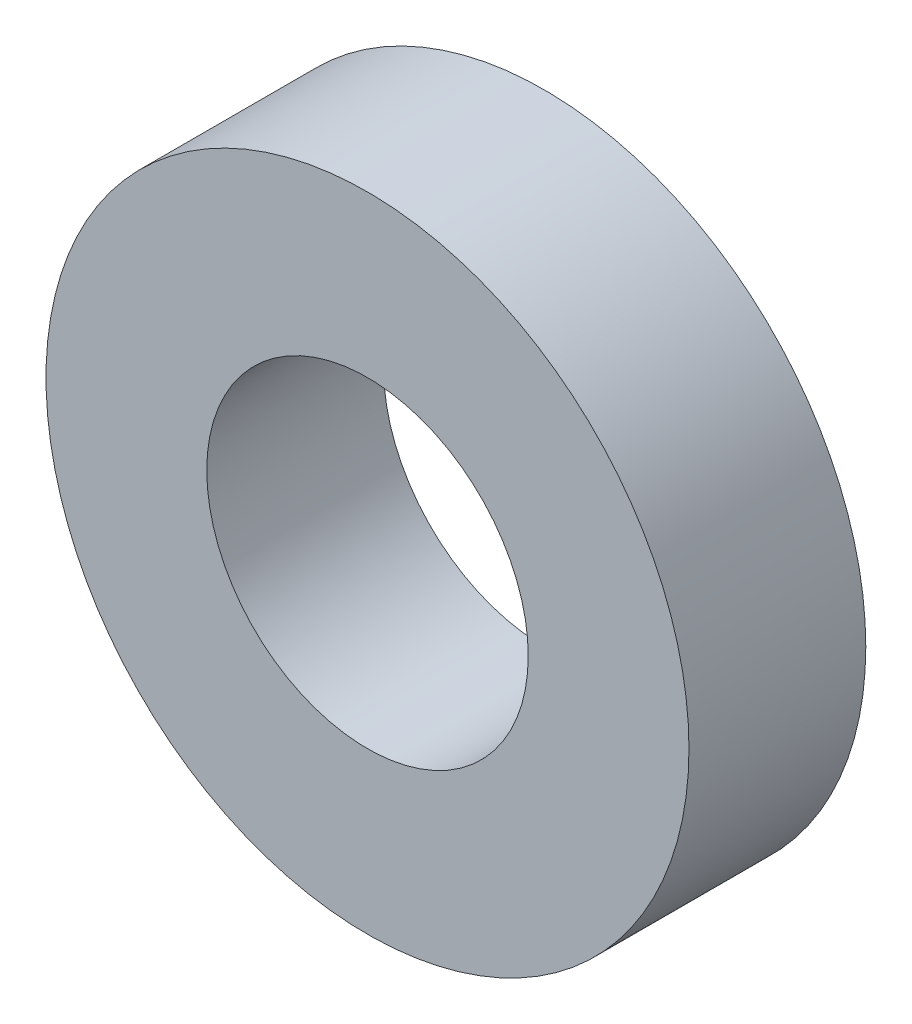
ISO-10303-21;
HEADER;
FILE_DESCRIPTION(('STEP AP214'),'2;1');
FILE_NAME('part.step','',(''),(''),'','','');
FILE_SCHEMA(('AUTOMOTIVE_DESIGN { 1 0 10303 214 1 1 1 1 }'));
ENDSEC;
DATA;
#1=APPLICATION_CONTEXT('core data for automotive mechanical design processes');
#2=APPLICATION_PROTOCOL_DEFINITION('international standard','automotive_design',2000,#1);
#3=PRODUCT_CONTEXT('',#1,'mechanical');
#4=PRODUCT('Part','Part','',(#3));
#5=PRODUCT_RELATED_PRODUCT_CATEGORY('part','',(#4));
#6=PRODUCT_DEFINITION_FORMATION('','',#4);
#7=PRODUCT_DEFINITION_CONTEXT('part definition',#1,'design');
#8=PRODUCT_DEFINITION('design','',#6,#7);
#9=PRODUCT_DEFINITION_SHAPE('','',#8);
#10=(LENGTH_UNIT() NAMED_UNIT(*) SI_UNIT(.MILLI.,.METRE.));
#11=(NAMED_UNIT(*) PLANE_ANGLE_UNIT() SI_UNIT($,.RADIAN.));
#12=(NAMED_UNIT(*) SI_UNIT($,.STERADIAN.) SOLID_ANGLE_UNIT());
#13=UNCERTAINTY_MEASURE_WITH_UNIT(LENGTH_MEASURE(1.E-05),#10,'distance_accuracy_value','');
#14=(GEOMETRIC_REPRESENTATION_CONTEXT(3) GLOBAL_UNCERTAINTY_ASSIGNED_CONTEXT((#13)) GLOBAL_UNIT_ASSIGNED_CONTEXT((#10,
#11,#12)) REPRESENTATION_CONTEXT('',''));
#15=CARTESIAN_POINT('',(0.,0.,0.));
#16=DIRECTION('',(0.,0.,1.));
#17=DIRECTION('',(1.,0.,0.));
#18=AXIS2_PLACEMENT_3D('',#15,#16,#17);
#19=CARTESIAN_POINT('',(0.,0.,1.65));
#20=DIRECTION('',(0.,0.,1.));
#21=DIRECTION('',(1.,0.,0.));
#22=AXIS2_PLACEMENT_3D('',#19,#20,#21);
#23=PLANE('',#22);
#24=CARTESIAN_POINT('',(0.,0.,1.65));
#25=DIRECTION('',(0.,0.,1.));
#26=DIRECTION('',(1.,0.,0.));
#27=AXIS2_PLACEMENT_3D('',#24,#25,#26);
#28=CIRCLE('',#27,3.);
#29=CARTESIAN_POINT('',(3.,0.,1.65));
#30=VERTEX_POINT('',#29);
#31=EDGE_CURVE('E10',#30,#30,#28,.T.);
#32=ORIENTED_EDGE('',*,*,#31,.T.);
#33=EDGE_LOOP('',(#32));
#34=FACE_BOUND('',#33,.T.);
#35=CARTESIAN_POINT('',(0.,0.,1.65));
#36=DIRECTION('',(0.,0.,1.));
#37=DIRECTION('',(1.,0.,0.));
#38=AXIS2_PLACEMENT_3D('',#35,#36,#37);
#39=CIRCLE('',#38,1.5);
#40=CARTESIAN_POINT('',(1.5,0.,1.65));
#41=VERTEX_POINT('',#40);
#42=EDGE_CURVE('E26',#41,#41,#39,.T.);
#43=ORIENTED_EDGE('',*,*,#42,.F.);
#44=EDGE_LOOP('',(#43));
#45=FACE_BOUND('',#44,.T.);
#46=ADVANCED_FACE('F15',(#34,#45),#23,.T.);
#47=CARTESIAN_POINT('',(0.,0.,0.));
#48=DIRECTION('',(0.,0.,1.));
#49=DIRECTION('',(1.,0.,0.));
#50=AXIS2_PLACEMENT_3D('',#47,#48,#49);
#51=PLANE('',#50);
#52=CARTESIAN_POINT('',(0.,0.,0.));
#53=DIRECTION('',(0.,0.,1.));
#54=DIRECTION('',(1.,0.,0.));
#55=AXIS2_PLACEMENT_3D('',#52,#53,#54);
#56=CIRCLE('',#55,3.);
#57=CARTESIAN_POINT('',(3.,0.,0.));
#58=VERTEX_POINT('',#57);
#59=EDGE_CURVE('E19',#58,#58,#56,.T.);
#60=ORIENTED_EDGE('',*,*,#59,.F.);
#61=EDGE_LOOP('',(#60));
#62=FACE_BOUND('',#61,.T.);
#63=CARTESIAN_POINT('',(0.,0.,0.));
#64=DIRECTION('',(0.,0.,1.));
#65=DIRECTION('',(1.,0.,0.));
#66=AXIS2_PLACEMENT_3D('',#63,#64,#65);
#67=CIRCLE('',#66,1.5);
#68=CARTESIAN_POINT('',(1.5,0.,0.));
#69=VERTEX_POINT('',#68);
#70=EDGE_CURVE('E28',#69,#69,#67,.T.);
#71=ORIENTED_EDGE('',*,*,#70,.T.);
#72=EDGE_LOOP('',(#71));
#73=FACE_BOUND('',#72,.T.);
#74=ADVANCED_FACE('F38',(#62,#73),#51,.F.);
#75=CARTESIAN_POINT('',(0.,0.,1.65));
#76=DIRECTION('',(0.,0.,-1.));
#77=DIRECTION('',(-1.,0.,0.));
#78=AXIS2_PLACEMENT_3D('',#75,#76,#77);
#79=CYLINDRICAL_SURFACE('',#78,3.);
#80=ORIENTED_EDGE('',*,*,#31,.F.);
#81=EDGE_LOOP('',(#80));
#82=FACE_BOUND('',#81,.T.);
#83=ORIENTED_EDGE('',*,*,#59,.T.);
#84=EDGE_LOOP('',(#83));
#85=FACE_BOUND('',#84,.T.);
#86=ADVANCED_FACE('F17',(#82,#85),#79,.T.);
#87=CARTESIAN_POINT('',(0.,0.,1.65));
#88=DIRECTION('',(0.,0.,-1.));
#89=DIRECTION('',(-1.,0.,0.));
#90=AXIS2_PLACEMENT_3D('',#87,#88,#89);
#91=CYLINDRICAL_SURFACE('',#90,1.5);
#92=ORIENTED_EDGE('',*,*,#42,.T.);
#93=EDGE_LOOP('',(#92));
#94=FACE_BOUND('',#93,.T.);
#95=ORIENTED_EDGE('',*,*,#70,.F.);
#96=EDGE_LOOP('',(#95));
#97=FACE_BOUND('',#96,.T.);
#98=ADVANCED_FACE('F34',(#94,#97),#91,.F.);
#99=CLOSED_SHELL('',(#46,#74,#86,#98));
#100=MANIFOLD_SOLID_BREP('B1',#99);
#101=ADVANCED_BREP_SHAPE_REPRESENTATION('',(#18,#100),#14);
#102=SHAPE_DEFINITION_REPRESENTATION(#9,#101);
ENDSEC;
END-ISO-10303-21;
